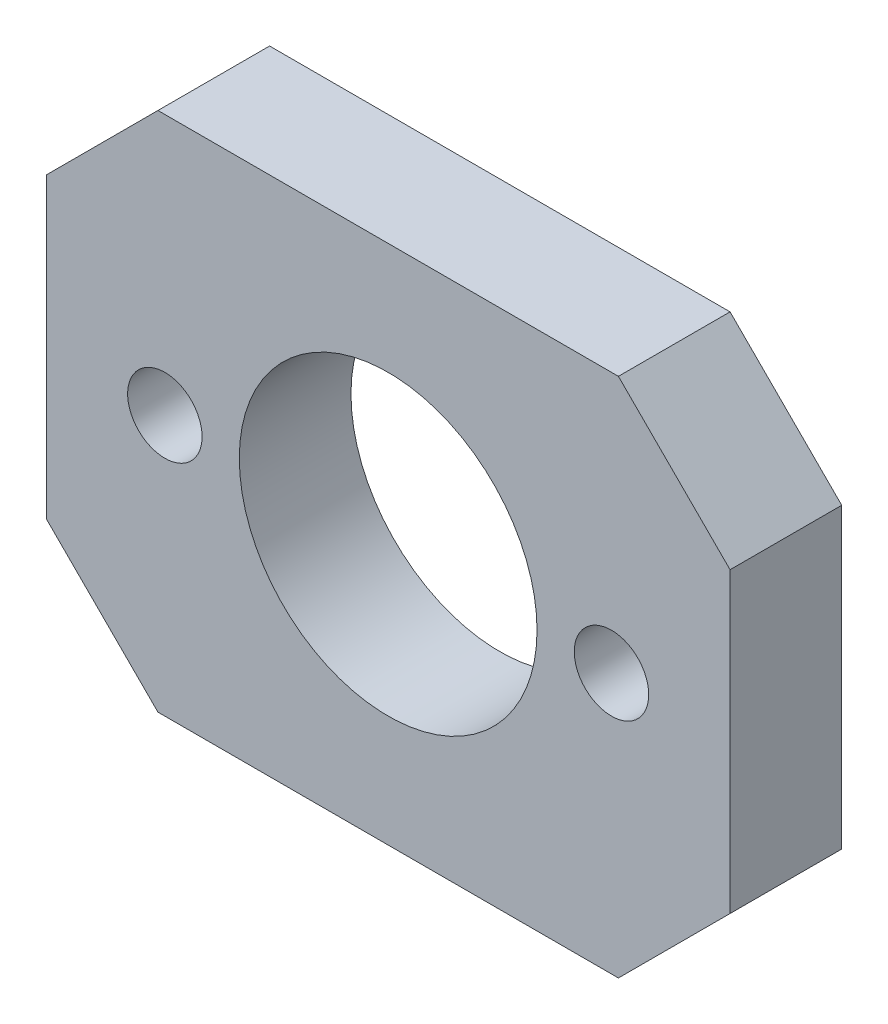
ISO-10303-21;
HEADER;
FILE_DESCRIPTION(('STEP AP214'),'2;1');
FILE_NAME('part.step','',(''),(''),'','','');
FILE_SCHEMA(('AUTOMOTIVE_DESIGN { 1 0 10303 214 1 1 1 1 }'));
ENDSEC;
DATA;
#1=APPLICATION_CONTEXT('core data for automotive mechanical design processes');
#2=APPLICATION_PROTOCOL_DEFINITION('international standard','automotive_design',2000,#1);
#3=PRODUCT_CONTEXT('',#1,'mechanical');
#4=PRODUCT('Part','Part','',(#3));
#5=PRODUCT_RELATED_PRODUCT_CATEGORY('part','',(#4));
#6=PRODUCT_DEFINITION_FORMATION('','',#4);
#7=PRODUCT_DEFINITION_CONTEXT('part definition',#1,'design');
#8=PRODUCT_DEFINITION('design','',#6,#7);
#9=PRODUCT_DEFINITION_SHAPE('','',#8);
#10=(LENGTH_UNIT() NAMED_UNIT(*) SI_UNIT(.MILLI.,.METRE.));
#11=(NAMED_UNIT(*) PLANE_ANGLE_UNIT() SI_UNIT($,.RADIAN.));
#12=(NAMED_UNIT(*) SI_UNIT($,.STERADIAN.) SOLID_ANGLE_UNIT());
#13=UNCERTAINTY_MEASURE_WITH_UNIT(LENGTH_MEASURE(1.E-05),#10,'distance_accuracy_value','');
#14=(GEOMETRIC_REPRESENTATION_CONTEXT(3) GLOBAL_UNCERTAINTY_ASSIGNED_CONTEXT((#13)) GLOBAL_UNIT_ASSIGNED_CONTEXT((#10,
#11,#12)) REPRESENTATION_CONTEXT('',''));
#15=CARTESIAN_POINT('',(0.,0.,0.));
#16=DIRECTION('',(0.,0.,1.));
#17=DIRECTION('',(1.,0.,0.));
#18=AXIS2_PLACEMENT_3D('',#15,#16,#17);
#19=CARTESIAN_POINT('',(0.,0.,3.));
#20=DIRECTION('',(0.,0.,-1.));
#21=DIRECTION('',(-1.,0.,0.));
#22=AXIS2_PLACEMENT_3D('',#19,#20,#21);
#23=PLANE('',#22);
#24=DIRECTION('',(0.,-1.,0.));
#25=VECTOR('',#24,1.);
#26=CARTESIAN_POINT('',(-9.18600557682286,-7.,3.));
#27=LINE('',#26,#25);
#28=CARTESIAN_POINT('',(-9.18600557682286,3.99999999999999,3.));
#29=VERTEX_POINT('',#28);
#30=CARTESIAN_POINT('',(-9.18600557682286,-3.99999999999999,3.));
#31=VERTEX_POINT('',#30);
#32=EDGE_CURVE('E164',#29,#31,#27,.T.);
#33=ORIENTED_EDGE('',*,*,#32,.T.);
#34=DIRECTION('',(-0.707106781186547,0.707106781186548,0.));
#35=VECTOR('',#34,1.);
#36=CARTESIAN_POINT('',(-6.18600557682285,-7.,3.));
#37=LINE('',#36,#35);
#38=CARTESIAN_POINT('',(-6.18600557682285,-7.,3.));
#39=VERTEX_POINT('',#38);
#40=EDGE_CURVE('E147',#31,#39,#37,.F.);
#41=ORIENTED_EDGE('',*,*,#40,.T.);
#42=DIRECTION('',(1.,0.,0.));
#43=VECTOR('',#42,1.);
#44=CARTESIAN_POINT('',(-9.18600557682286,-7.,3.));
#45=LINE('',#44,#43);
#46=CARTESIAN_POINT('',(6.18600557682283,-7.,3.));
#47=VERTEX_POINT('',#46);
#48=EDGE_CURVE('E118',#39,#47,#45,.T.);
#49=ORIENTED_EDGE('',*,*,#48,.T.);
#50=DIRECTION('',(-0.707106781186549,-0.707106781186546,0.));
#51=VECTOR('',#50,1.);
#52=CARTESIAN_POINT('',(9.18600557682285,-4.,3.));
#53=LINE('',#52,#51);
#54=CARTESIAN_POINT('',(9.18600557682285,-4.,3.));
#55=VERTEX_POINT('',#54);
#56=EDGE_CURVE('E145',#47,#55,#53,.F.);
#57=ORIENTED_EDGE('',*,*,#56,.T.);
#58=DIRECTION('',(0.,1.,0.));
#59=VECTOR('',#58,1.);
#60=CARTESIAN_POINT('',(9.18600557682285,-7.,3.));
#61=LINE('',#60,#59);
#62=CARTESIAN_POINT('',(9.18600557682285,3.99999999999999,3.));
#63=VERTEX_POINT('',#62);
#64=EDGE_CURVE('E125',#55,#63,#61,.T.);
#65=ORIENTED_EDGE('',*,*,#64,.T.);
#66=DIRECTION('',(0.707106781186547,-0.707106781186548,0.));
#67=VECTOR('',#66,1.);
#68=CARTESIAN_POINT('',(6.18600557682285,7.,3.));
#69=LINE('',#68,#67);
#70=CARTESIAN_POINT('',(6.18600557682284,7.,3.));
#71=VERTEX_POINT('',#70);
#72=EDGE_CURVE('E53',#63,#71,#69,.F.);
#73=ORIENTED_EDGE('',*,*,#72,.T.);
#74=DIRECTION('',(-1.,0.,0.));
#75=VECTOR('',#74,1.);
#76=CARTESIAN_POINT('',(-9.18600557682286,7.,3.));
#77=LINE('',#76,#75);
#78=CARTESIAN_POINT('',(-6.18600557682284,7.,3.));
#79=VERTEX_POINT('',#78);
#80=EDGE_CURVE('E128',#71,#79,#77,.T.);
#81=ORIENTED_EDGE('',*,*,#80,.T.);
#82=DIRECTION('',(0.707106781186549,0.707106781186546,0.));
#83=VECTOR('',#82,1.);
#84=CARTESIAN_POINT('',(-9.18600557682286,4.,3.));
#85=LINE('',#84,#83);
#86=EDGE_CURVE('E143',#79,#29,#85,.F.);
#87=ORIENTED_EDGE('',*,*,#86,.T.);
#88=EDGE_LOOP('',(#33,#41,#49,#57,#65,#73,#81,#87));
#89=FACE_BOUND('',#88,.T.);
#90=CARTESIAN_POINT('',(-6.,0.,3.));
#91=DIRECTION('',(0.,0.,1.));
#92=DIRECTION('',(1.,0.,0.));
#93=AXIS2_PLACEMENT_3D('',#90,#91,#92);
#94=CIRCLE('',#93,1.);
#95=CARTESIAN_POINT('',(-5.,0.,3.));
#96=VERTEX_POINT('',#95);
#97=EDGE_CURVE('E160',#96,#96,#94,.T.);
#98=ORIENTED_EDGE('',*,*,#97,.F.);
#99=EDGE_LOOP('',(#98));
#100=FACE_BOUND('',#99,.T.);
#101=CARTESIAN_POINT('',(6.,0.,3.));
#102=DIRECTION('',(0.,0.,1.));
#103=DIRECTION('',(1.,0.,0.));
#104=AXIS2_PLACEMENT_3D('',#101,#102,#103);
#105=CIRCLE('',#104,1.);
#106=CARTESIAN_POINT('',(7.,0.,3.));
#107=VERTEX_POINT('',#106);
#108=EDGE_CURVE('E171',#107,#107,#105,.T.);
#109=ORIENTED_EDGE('',*,*,#108,.F.);
#110=EDGE_LOOP('',(#109));
#111=FACE_BOUND('',#110,.T.);
#112=CARTESIAN_POINT('',(0.,0.,3.));
#113=DIRECTION('',(0.,0.,1.));
#114=DIRECTION('',(1.,0.,0.));
#115=AXIS2_PLACEMENT_3D('',#112,#113,#114);
#116=CIRCLE('',#115,4.);
#117=CARTESIAN_POINT('',(4.,0.,3.));
#118=VERTEX_POINT('',#117);
#119=EDGE_CURVE('E177',#118,#118,#116,.T.);
#120=ORIENTED_EDGE('',*,*,#119,.F.);
#121=EDGE_LOOP('',(#120));
#122=FACE_BOUND('',#121,.T.);
#123=ADVANCED_FACE('F33',(#89,#100,#111,#122),#23,.F.);
#124=CARTESIAN_POINT('',(0.,0.,0.));
#125=DIRECTION('',(0.,0.,-1.));
#126=DIRECTION('',(-1.,0.,0.));
#127=AXIS2_PLACEMENT_3D('',#124,#125,#126);
#128=PLANE('',#127);
#129=CARTESIAN_POINT('',(6.,0.,0.));
#130=DIRECTION('',(0.,0.,1.));
#131=DIRECTION('',(1.,0.,0.));
#132=AXIS2_PLACEMENT_3D('',#129,#130,#131);
#133=CIRCLE('',#132,1.);
#134=CARTESIAN_POINT('',(7.,0.,0.));
#135=VERTEX_POINT('',#134);
#136=EDGE_CURVE('E174',#135,#135,#133,.T.);
#137=ORIENTED_EDGE('',*,*,#136,.T.);
#138=EDGE_LOOP('',(#137));
#139=FACE_BOUND('',#138,.T.);
#140=DIRECTION('',(1.,0.,0.));
#141=VECTOR('',#140,1.);
#142=CARTESIAN_POINT('',(-9.18600557682286,-7.,0.));
#143=LINE('',#142,#141);
#144=CARTESIAN_POINT('',(-6.18600557682285,-7.,0.));
#145=VERTEX_POINT('',#144);
#146=CARTESIAN_POINT('',(6.18600557682284,-7.,0.));
#147=VERTEX_POINT('',#146);
#148=EDGE_CURVE('E115',#145,#147,#143,.T.);
#149=ORIENTED_EDGE('',*,*,#148,.F.);
#150=DIRECTION('',(0.707106781186547,-0.707106781186548,0.));
#151=VECTOR('',#150,1.);
#152=CARTESIAN_POINT('',(-6.59300278841143,-6.59300278841142,0.));
#153=LINE('',#152,#151);
#154=CARTESIAN_POINT('',(-9.18600557682286,-3.99999999999999,0.));
#155=VERTEX_POINT('',#154);
#156=EDGE_CURVE('E98',#145,#155,#153,.F.);
#157=ORIENTED_EDGE('',*,*,#156,.T.);
#158=DIRECTION('',(0.,-1.,0.));
#159=VECTOR('',#158,1.);
#160=CARTESIAN_POINT('',(-9.18600557682286,-7.,0.));
#161=LINE('',#160,#159);
#162=CARTESIAN_POINT('',(-9.18600557682286,3.99999999999999,0.));
#163=VERTEX_POINT('',#162);
#164=EDGE_CURVE('E126',#163,#155,#161,.T.);
#165=ORIENTED_EDGE('',*,*,#164,.F.);
#166=DIRECTION('',(-0.707106781186549,-0.707106781186546,0.));
#167=VECTOR('',#166,1.);
#168=CARTESIAN_POINT('',(-6.59300278841141,6.59300278841143,0.));
#169=LINE('',#168,#167);
#170=CARTESIAN_POINT('',(-6.18600557682284,7.,0.));
#171=VERTEX_POINT('',#170);
#172=EDGE_CURVE('E136',#163,#171,#169,.F.);
#173=ORIENTED_EDGE('',*,*,#172,.T.);
#174=DIRECTION('',(-1.,0.,0.));
#175=VECTOR('',#174,1.);
#176=CARTESIAN_POINT('',(-9.18600557682286,7.,0.));
#177=LINE('',#176,#175);
#178=CARTESIAN_POINT('',(6.18600557682285,7.,0.));
#179=VERTEX_POINT('',#178);
#180=EDGE_CURVE('E130',#179,#171,#177,.T.);
#181=ORIENTED_EDGE('',*,*,#180,.F.);
#182=DIRECTION('',(-0.707106781186547,0.707106781186548,0.));
#183=VECTOR('',#182,1.);
#184=CARTESIAN_POINT('',(6.59300278841143,6.59300278841142,0.));
#185=LINE('',#184,#183);
#186=CARTESIAN_POINT('',(9.18600557682285,3.99999999999999,0.));
#187=VERTEX_POINT('',#186);
#188=EDGE_CURVE('E119',#179,#187,#185,.F.);
#189=ORIENTED_EDGE('',*,*,#188,.T.);
#190=DIRECTION('',(0.,1.,0.));
#191=VECTOR('',#190,1.);
#192=CARTESIAN_POINT('',(9.18600557682285,-7.,0.));
#193=LINE('',#192,#191);
#194=CARTESIAN_POINT('',(9.18600557682285,-4.,0.));
#195=VERTEX_POINT('',#194);
#196=EDGE_CURVE('E159',#195,#187,#193,.T.);
#197=ORIENTED_EDGE('',*,*,#196,.F.);
#198=DIRECTION('',(0.707106781186549,0.707106781186546,0.));
#199=VECTOR('',#198,1.);
#200=CARTESIAN_POINT('',(6.59300278841141,-6.59300278841143,0.));
#201=LINE('',#200,#199);
#202=EDGE_CURVE('E109',#195,#147,#201,.F.);
#203=ORIENTED_EDGE('',*,*,#202,.T.);
#204=EDGE_LOOP('',(#149,#157,#165,#173,#181,#189,#197,#203));
#205=FACE_BOUND('',#204,.T.);
#206=CARTESIAN_POINT('',(-6.,0.,0.));
#207=DIRECTION('',(0.,0.,1.));
#208=DIRECTION('',(1.,0.,0.));
#209=AXIS2_PLACEMENT_3D('',#206,#207,#208);
#210=CIRCLE('',#209,1.);
#211=CARTESIAN_POINT('',(-5.,0.,0.));
#212=VERTEX_POINT('',#211);
#213=EDGE_CURVE('E168',#212,#212,#210,.T.);
#214=ORIENTED_EDGE('',*,*,#213,.T.);
#215=EDGE_LOOP('',(#214));
#216=FACE_BOUND('',#215,.T.);
#217=CARTESIAN_POINT('',(0.,0.,0.));
#218=DIRECTION('',(0.,0.,1.));
#219=DIRECTION('',(1.,0.,0.));
#220=AXIS2_PLACEMENT_3D('',#217,#218,#219);
#221=CIRCLE('',#220,4.);
#222=CARTESIAN_POINT('',(4.,0.,0.));
#223=VERTEX_POINT('',#222);
#224=EDGE_CURVE('E180',#223,#223,#221,.T.);
#225=ORIENTED_EDGE('',*,*,#224,.T.);
#226=EDGE_LOOP('',(#225));
#227=FACE_BOUND('',#226,.T.);
#228=ADVANCED_FACE('F122',(#139,#205,#216,#227),#128,.T.);
#229=CARTESIAN_POINT('',(9.18600557682285,-7.,3.));
#230=DIRECTION('',(-1.,0.,0.));
#231=DIRECTION('',(0.,0.,1.));
#232=AXIS2_PLACEMENT_3D('',#229,#230,#231);
#233=PLANE('',#232);
#234=ORIENTED_EDGE('',*,*,#64,.F.);
#235=DIRECTION('',(0.,0.,-1.));
#236=VECTOR('',#235,1.);
#237=CARTESIAN_POINT('',(9.18600557682285,-4.,3.));
#238=LINE('',#237,#236);
#239=EDGE_CURVE('E151',#55,#195,#238,.T.);
#240=ORIENTED_EDGE('',*,*,#239,.T.);
#241=ORIENTED_EDGE('',*,*,#196,.T.);
#242=DIRECTION('',(0.,0.,1.));
#243=VECTOR('',#242,1.);
#244=CARTESIAN_POINT('',(9.18600557682285,3.99999999999999,3.));
#245=LINE('',#244,#243);
#246=EDGE_CURVE('E149',#187,#63,#245,.T.);
#247=ORIENTED_EDGE('',*,*,#246,.T.);
#248=EDGE_LOOP('',(#234,#240,#241,#247));
#249=FACE_BOUND('',#248,.T.);
#250=ADVANCED_FACE('F194',(#249),#233,.F.);
#251=CARTESIAN_POINT('',(-9.18600557682286,7.,3.));
#252=DIRECTION('',(0.,-1.,0.));
#253=DIRECTION('',(0.,0.,-1.));
#254=AXIS2_PLACEMENT_3D('',#251,#252,#253);
#255=PLANE('',#254);
#256=ORIENTED_EDGE('',*,*,#180,.T.);
#257=DIRECTION('',(0.,0.,1.));
#258=VECTOR('',#257,1.);
#259=CARTESIAN_POINT('',(-6.18600557682284,7.,3.));
#260=LINE('',#259,#258);
#261=EDGE_CURVE('E11',#171,#79,#260,.T.);
#262=ORIENTED_EDGE('',*,*,#261,.T.);
#263=ORIENTED_EDGE('',*,*,#80,.F.);
#264=DIRECTION('',(0.,0.,-1.));
#265=VECTOR('',#264,1.);
#266=CARTESIAN_POINT('',(6.18600557682285,7.,3.));
#267=LINE('',#266,#265);
#268=EDGE_CURVE('E41',#71,#179,#267,.T.);
#269=ORIENTED_EDGE('',*,*,#268,.T.);
#270=EDGE_LOOP('',(#256,#262,#263,#269));
#271=FACE_BOUND('',#270,.T.);
#272=ADVANCED_FACE('F156',(#271),#255,.F.);
#273=CARTESIAN_POINT('',(-9.18600557682286,-7.,3.));
#274=DIRECTION('',(1.,0.,0.));
#275=DIRECTION('',(0.,0.,-1.));
#276=AXIS2_PLACEMENT_3D('',#273,#274,#275);
#277=PLANE('',#276);
#278=ORIENTED_EDGE('',*,*,#164,.T.);
#279=DIRECTION('',(0.,0.,1.));
#280=VECTOR('',#279,1.);
#281=CARTESIAN_POINT('',(-9.18600557682286,-3.99999999999999,3.));
#282=LINE('',#281,#280);
#283=EDGE_CURVE('E103',#155,#31,#282,.T.);
#284=ORIENTED_EDGE('',*,*,#283,.T.);
#285=ORIENTED_EDGE('',*,*,#32,.F.);
#286=DIRECTION('',(0.,0.,-1.));
#287=VECTOR('',#286,1.);
#288=CARTESIAN_POINT('',(-9.18600557682286,4.,3.));
#289=LINE('',#288,#287);
#290=EDGE_CURVE('E108',#29,#163,#289,.T.);
#291=ORIENTED_EDGE('',*,*,#290,.T.);
#292=EDGE_LOOP('',(#278,#284,#285,#291));
#293=FACE_BOUND('',#292,.T.);
#294=ADVANCED_FACE('F204',(#293),#277,.F.);
#295=CARTESIAN_POINT('',(-9.18600557682286,-7.,3.));
#296=DIRECTION('',(0.,1.,0.));
#297=DIRECTION('',(0.,0.,1.));
#298=AXIS2_PLACEMENT_3D('',#295,#296,#297);
#299=PLANE('',#298);
#300=ORIENTED_EDGE('',*,*,#48,.F.);
#301=DIRECTION('',(0.,0.,-1.));
#302=VECTOR('',#301,1.);
#303=CARTESIAN_POINT('',(-6.18600557682285,-7.,3.));
#304=LINE('',#303,#302);
#305=EDGE_CURVE('E102',#39,#145,#304,.T.);
#306=ORIENTED_EDGE('',*,*,#305,.T.);
#307=ORIENTED_EDGE('',*,*,#148,.T.);
#308=DIRECTION('',(0.,0.,1.));
#309=VECTOR('',#308,1.);
#310=CARTESIAN_POINT('',(6.18600557682284,-7.,3.));
#311=LINE('',#310,#309);
#312=EDGE_CURVE('E120',#147,#47,#311,.T.);
#313=ORIENTED_EDGE('',*,*,#312,.T.);
#314=EDGE_LOOP('',(#300,#306,#307,#313));
#315=FACE_BOUND('',#314,.T.);
#316=ADVANCED_FACE('F114',(#315),#299,.F.);
#317=CARTESIAN_POINT('',(-6.,0.,3.));
#318=DIRECTION('',(0.,0.,-1.));
#319=DIRECTION('',(-1.,0.,0.));
#320=AXIS2_PLACEMENT_3D('',#317,#318,#319);
#321=CYLINDRICAL_SURFACE('',#320,1.);
#322=ORIENTED_EDGE('',*,*,#97,.T.);
#323=EDGE_LOOP('',(#322));
#324=FACE_BOUND('',#323,.T.);
#325=ORIENTED_EDGE('',*,*,#213,.F.);
#326=EDGE_LOOP('',(#325));
#327=FACE_BOUND('',#326,.T.);
#328=ADVANCED_FACE('F199',(#324,#327),#321,.F.);
#329=CARTESIAN_POINT('',(6.,0.,3.));
#330=DIRECTION('',(0.,0.,-1.));
#331=DIRECTION('',(-1.,0.,0.));
#332=AXIS2_PLACEMENT_3D('',#329,#330,#331);
#333=CYLINDRICAL_SURFACE('',#332,1.);
#334=ORIENTED_EDGE('',*,*,#108,.T.);
#335=EDGE_LOOP('',(#334));
#336=FACE_BOUND('',#335,.T.);
#337=ORIENTED_EDGE('',*,*,#136,.F.);
#338=EDGE_LOOP('',(#337));
#339=FACE_BOUND('',#338,.T.);
#340=ADVANCED_FACE('F294',(#336,#339),#333,.F.);
#341=CARTESIAN_POINT('',(0.,0.,3.));
#342=DIRECTION('',(0.,0.,-1.));
#343=DIRECTION('',(-1.,0.,0.));
#344=AXIS2_PLACEMENT_3D('',#341,#342,#343);
#345=CYLINDRICAL_SURFACE('',#344,4.);
#346=ORIENTED_EDGE('',*,*,#119,.T.);
#347=EDGE_LOOP('',(#346));
#348=FACE_BOUND('',#347,.T.);
#349=ORIENTED_EDGE('',*,*,#224,.F.);
#350=EDGE_LOOP('',(#349));
#351=FACE_BOUND('',#350,.T.);
#352=ADVANCED_FACE('F186',(#348,#351),#345,.F.);
#353=CARTESIAN_POINT('',(-6.18600557682285,-7.,3.));
#354=DIRECTION('',(0.707106781186548,0.707106781186547,0.));
#355=DIRECTION('',(0.,0.,-1.));
#356=AXIS2_PLACEMENT_3D('',#353,#354,#355);
#357=PLANE('',#356);
#358=ORIENTED_EDGE('',*,*,#40,.F.);
#359=ORIENTED_EDGE('',*,*,#283,.F.);
#360=ORIENTED_EDGE('',*,*,#156,.F.);
#361=ORIENTED_EDGE('',*,*,#305,.F.);
#362=EDGE_LOOP('',(#358,#359,#360,#361));
#363=FACE_BOUND('',#362,.T.);
#364=ADVANCED_FACE('F101',(#363),#357,.F.);
#365=CARTESIAN_POINT('',(9.18600557682285,-4.,3.));
#366=DIRECTION('',(-0.707106781186546,0.707106781186549,0.));
#367=DIRECTION('',(0.,0.,-1.));
#368=AXIS2_PLACEMENT_3D('',#365,#366,#367);
#369=PLANE('',#368);
#370=ORIENTED_EDGE('',*,*,#56,.F.);
#371=ORIENTED_EDGE('',*,*,#312,.F.);
#372=ORIENTED_EDGE('',*,*,#202,.F.);
#373=ORIENTED_EDGE('',*,*,#239,.F.);
#374=EDGE_LOOP('',(#370,#371,#372,#373));
#375=FACE_BOUND('',#374,.T.);
#376=ADVANCED_FACE('F215',(#375),#369,.F.);
#377=CARTESIAN_POINT('',(-9.18600557682286,4.,3.));
#378=DIRECTION('',(0.707106781186546,-0.707106781186549,0.));
#379=DIRECTION('',(0.,0.,-1.));
#380=AXIS2_PLACEMENT_3D('',#377,#378,#379);
#381=PLANE('',#380);
#382=ORIENTED_EDGE('',*,*,#86,.F.);
#383=ORIENTED_EDGE('',*,*,#261,.F.);
#384=ORIENTED_EDGE('',*,*,#172,.F.);
#385=ORIENTED_EDGE('',*,*,#290,.F.);
#386=EDGE_LOOP('',(#382,#383,#384,#385));
#387=FACE_BOUND('',#386,.T.);
#388=ADVANCED_FACE('F217',(#387),#381,.F.);
#389=CARTESIAN_POINT('',(6.18600557682285,7.,3.));
#390=DIRECTION('',(-0.707106781186548,-0.707106781186547,0.));
#391=DIRECTION('',(0.,0.,-1.));
#392=AXIS2_PLACEMENT_3D('',#389,#390,#391);
#393=PLANE('',#392);
#394=ORIENTED_EDGE('',*,*,#72,.F.);
#395=ORIENTED_EDGE('',*,*,#246,.F.);
#396=ORIENTED_EDGE('',*,*,#188,.F.);
#397=ORIENTED_EDGE('',*,*,#268,.F.);
#398=EDGE_LOOP('',(#394,#395,#396,#397));
#399=FACE_BOUND('',#398,.T.);
#400=ADVANCED_FACE('F35',(#399),#393,.F.);
#401=CLOSED_SHELL('',(#123,#228,#250,#272,#294,#316,#328,#340,#352,#364,#376,#388,#400));
#402=MANIFOLD_SOLID_BREP('B2',#401);
#403=ADVANCED_BREP_SHAPE_REPRESENTATION('',(#18,#402),#14);
#404=SHAPE_DEFINITION_REPRESENTATION(#9,#403);
ENDSEC;
END-ISO-10303-21;
